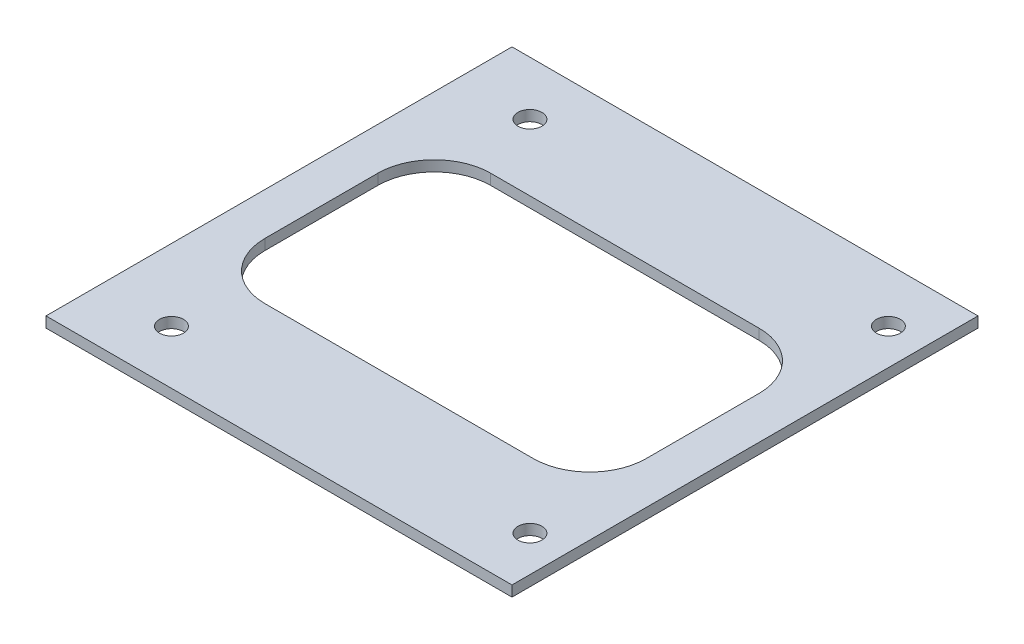
ISO-10303-21;
HEADER;
FILE_DESCRIPTION(('STEP AP214'),'2;1');
FILE_NAME('part.step','',(''),(''),'','','');
FILE_SCHEMA(('AUTOMOTIVE_DESIGN { 1 0 10303 214 1 1 1 1 }'));
ENDSEC;
DATA;
#1=APPLICATION_CONTEXT('core data for automotive mechanical design processes');
#2=APPLICATION_PROTOCOL_DEFINITION('international standard','automotive_design',2000,#1);
#3=PRODUCT_CONTEXT('',#1,'mechanical');
#4=PRODUCT('Part','Part','',(#3));
#5=PRODUCT_RELATED_PRODUCT_CATEGORY('part','',(#4));
#6=PRODUCT_DEFINITION_FORMATION('','',#4);
#7=PRODUCT_DEFINITION_CONTEXT('part definition',#1,'design');
#8=PRODUCT_DEFINITION('design','',#6,#7);
#9=PRODUCT_DEFINITION_SHAPE('','',#8);
#10=(LENGTH_UNIT() NAMED_UNIT(*) SI_UNIT(.MILLI.,.METRE.));
#11=(NAMED_UNIT(*) PLANE_ANGLE_UNIT() SI_UNIT($,.RADIAN.));
#12=(NAMED_UNIT(*) SI_UNIT($,.STERADIAN.) SOLID_ANGLE_UNIT());
#13=UNCERTAINTY_MEASURE_WITH_UNIT(LENGTH_MEASURE(1.E-05),#10,'distance_accuracy_value','');
#14=(GEOMETRIC_REPRESENTATION_CONTEXT(3) GLOBAL_UNCERTAINTY_ASSIGNED_CONTEXT((#13)) GLOBAL_UNIT_ASSIGNED_CONTEXT((#10,
#11,#12)) REPRESENTATION_CONTEXT('',''));
#15=CARTESIAN_POINT('',(0.,0.,0.));
#16=DIRECTION('',(0.,0.,1.));
#17=DIRECTION('',(1.,0.,0.));
#18=AXIS2_PLACEMENT_3D('',#15,#16,#17);
#19=CARTESIAN_POINT('',(82.55,3.75,-82.55));
#20=DIRECTION('',(-1.,0.,0.));
#21=DIRECTION('',(0.,0.,1.));
#22=AXIS2_PLACEMENT_3D('',#19,#20,#21);
#23=PLANE('',#22);
#24=DIRECTION('',(0.,0.,-1.));
#25=VECTOR('',#24,1.);
#26=CARTESIAN_POINT('',(82.55,0.,-82.55));
#27=LINE('',#26,#25);
#28=CARTESIAN_POINT('',(82.55,0.,82.55));
#29=VERTEX_POINT('',#28);
#30=CARTESIAN_POINT('',(82.55,0.,-82.55));
#31=VERTEX_POINT('',#30);
#32=EDGE_CURVE('E259',#29,#31,#27,.T.);
#33=ORIENTED_EDGE('',*,*,#32,.T.);
#34=DIRECTION('',(0.,-1.,0.));
#35=VECTOR('',#34,1.);
#36=CARTESIAN_POINT('',(82.55,3.75,-82.55));
#37=LINE('',#36,#35);
#38=CARTESIAN_POINT('',(82.55,3.75,-82.55));
#39=VERTEX_POINT('',#38);
#40=EDGE_CURVE('E13',#39,#31,#37,.T.);
#41=ORIENTED_EDGE('',*,*,#40,.F.);
#42=DIRECTION('',(0.,0.,-1.));
#43=VECTOR('',#42,1.);
#44=CARTESIAN_POINT('',(82.55,3.75,-82.55));
#45=LINE('',#44,#43);
#46=CARTESIAN_POINT('',(82.55,3.75,82.55));
#47=VERTEX_POINT('',#46);
#48=EDGE_CURVE('E260',#47,#39,#45,.T.);
#49=ORIENTED_EDGE('',*,*,#48,.F.);
#50=DIRECTION('',(0.,-1.,0.));
#51=VECTOR('',#50,1.);
#52=CARTESIAN_POINT('',(82.55,3.75,82.55));
#53=LINE('',#52,#51);
#54=EDGE_CURVE('E274',#47,#29,#53,.T.);
#55=ORIENTED_EDGE('',*,*,#54,.T.);
#56=EDGE_LOOP('',(#33,#41,#49,#55));
#57=FACE_BOUND('',#56,.T.);
#58=ADVANCED_FACE('F56',(#57),#23,.F.);
#59=CARTESIAN_POINT('',(-82.55,3.75,-82.55));
#60=DIRECTION('',(0.,0.,1.));
#61=DIRECTION('',(1.,0.,0.));
#62=AXIS2_PLACEMENT_3D('',#59,#60,#61);
#63=PLANE('',#62);
#64=DIRECTION('',(-1.,0.,0.));
#65=VECTOR('',#64,1.);
#66=CARTESIAN_POINT('',(-82.55,0.,-82.55));
#67=LINE('',#66,#65);
#68=CARTESIAN_POINT('',(-82.55,0.,-82.55));
#69=VERTEX_POINT('',#68);
#70=EDGE_CURVE('E278',#31,#69,#67,.T.);
#71=ORIENTED_EDGE('',*,*,#70,.T.);
#72=DIRECTION('',(0.,-1.,0.));
#73=VECTOR('',#72,1.);
#74=CARTESIAN_POINT('',(-82.55,3.75,-82.55));
#75=LINE('',#74,#73);
#76=CARTESIAN_POINT('',(-82.55,3.75,-82.55));
#77=VERTEX_POINT('',#76);
#78=EDGE_CURVE('E64',#77,#69,#75,.T.);
#79=ORIENTED_EDGE('',*,*,#78,.F.);
#80=DIRECTION('',(-1.,0.,0.));
#81=VECTOR('',#80,1.);
#82=CARTESIAN_POINT('',(-82.55,3.75,-82.55));
#83=LINE('',#82,#81);
#84=EDGE_CURVE('E264',#39,#77,#83,.T.);
#85=ORIENTED_EDGE('',*,*,#84,.F.);
#86=ORIENTED_EDGE('',*,*,#40,.T.);
#87=EDGE_LOOP('',(#71,#79,#85,#86));
#88=FACE_BOUND('',#87,.T.);
#89=ADVANCED_FACE('F312',(#88),#63,.F.);
#90=CARTESIAN_POINT('',(-82.55,3.75,-82.55));
#91=DIRECTION('',(1.,0.,0.));
#92=DIRECTION('',(0.,0.,-1.));
#93=AXIS2_PLACEMENT_3D('',#90,#91,#92);
#94=PLANE('',#93);
#95=DIRECTION('',(0.,0.,1.));
#96=VECTOR('',#95,1.);
#97=CARTESIAN_POINT('',(-82.55,0.,-82.55));
#98=LINE('',#97,#96);
#99=CARTESIAN_POINT('',(-82.55,0.,82.55));
#100=VERTEX_POINT('',#99);
#101=EDGE_CURVE('E281',#69,#100,#98,.T.);
#102=ORIENTED_EDGE('',*,*,#101,.T.);
#103=DIRECTION('',(0.,-1.,0.));
#104=VECTOR('',#103,1.);
#105=CARTESIAN_POINT('',(-82.55,3.75,82.55));
#106=LINE('',#105,#104);
#107=CARTESIAN_POINT('',(-82.55,3.75,82.55));
#108=VERTEX_POINT('',#107);
#109=EDGE_CURVE('E289',#108,#100,#106,.T.);
#110=ORIENTED_EDGE('',*,*,#109,.F.);
#111=DIRECTION('',(0.,0.,1.));
#112=VECTOR('',#111,1.);
#113=CARTESIAN_POINT('',(-82.55,3.75,-82.55));
#114=LINE('',#113,#112);
#115=EDGE_CURVE('E268',#77,#108,#114,.T.);
#116=ORIENTED_EDGE('',*,*,#115,.F.);
#117=ORIENTED_EDGE('',*,*,#78,.T.);
#118=EDGE_LOOP('',(#102,#110,#116,#117));
#119=FACE_BOUND('',#118,.T.);
#120=ADVANCED_FACE('F297',(#119),#94,.F.);
#121=CARTESIAN_POINT('',(-82.55,3.75,82.55));
#122=DIRECTION('',(0.,0.,-1.));
#123=DIRECTION('',(-1.,0.,0.));
#124=AXIS2_PLACEMENT_3D('',#121,#122,#123);
#125=PLANE('',#124);
#126=DIRECTION('',(1.,0.,0.));
#127=VECTOR('',#126,1.);
#128=CARTESIAN_POINT('',(-82.55,0.,82.55));
#129=LINE('',#128,#127);
#130=EDGE_CURVE('E265',#100,#29,#129,.T.);
#131=ORIENTED_EDGE('',*,*,#130,.T.);
#132=ORIENTED_EDGE('',*,*,#54,.F.);
#133=DIRECTION('',(1.,0.,0.));
#134=VECTOR('',#133,1.);
#135=CARTESIAN_POINT('',(-82.55,3.75,82.55));
#136=LINE('',#135,#134);
#137=EDGE_CURVE('E271',#108,#47,#136,.T.);
#138=ORIENTED_EDGE('',*,*,#137,.F.);
#139=ORIENTED_EDGE('',*,*,#109,.T.);
#140=EDGE_LOOP('',(#131,#132,#138,#139));
#141=FACE_BOUND('',#140,.T.);
#142=ADVANCED_FACE('F306',(#141),#125,.F.);
#143=CARTESIAN_POINT('',(0.,3.75,0.));
#144=DIRECTION('',(0.,1.,0.));
#145=DIRECTION('',(0.,0.,1.));
#146=AXIS2_PLACEMENT_3D('',#143,#144,#145);
#147=PLANE('',#146);
#148=CARTESIAN_POINT('',(-47.55,3.75,-19.9999999999999));
#149=DIRECTION('',(0.,1.,0.));
#150=DIRECTION('',(0.,0.,1.));
#151=AXIS2_PLACEMENT_3D('',#148,#149,#150);
#152=CIRCLE('',#151,20.);
#153=CARTESIAN_POINT('',(-67.55,3.75,-19.9999999999999));
#154=VERTEX_POINT('',#153);
#155=CARTESIAN_POINT('',(-47.55,3.75,-40.));
#156=VERTEX_POINT('',#155);
#157=EDGE_CURVE('E171',#154,#156,#152,.F.);
#158=ORIENTED_EDGE('',*,*,#157,.T.);
#159=DIRECTION('',(1.,0.,0.));
#160=VECTOR('',#159,1.);
#161=CARTESIAN_POINT('',(47.55,3.75,-39.9999999999999));
#162=LINE('',#161,#160);
#163=CARTESIAN_POINT('',(47.55,3.75,-39.9999999999999));
#164=VERTEX_POINT('',#163);
#165=EDGE_CURVE('E159',#156,#164,#162,.T.);
#166=ORIENTED_EDGE('',*,*,#165,.T.);
#167=CARTESIAN_POINT('',(47.55,3.75,-19.9999999999999));
#168=DIRECTION('',(0.,1.,0.));
#169=DIRECTION('',(0.,0.,1.));
#170=AXIS2_PLACEMENT_3D('',#167,#168,#169);
#171=CIRCLE('',#170,20.);
#172=CARTESIAN_POINT('',(67.55,3.75,-19.9999999999999));
#173=VERTEX_POINT('',#172);
#174=EDGE_CURVE('E382',#164,#173,#171,.F.);
#175=ORIENTED_EDGE('',*,*,#174,.T.);
#176=DIRECTION('',(0.,0.,1.));
#177=VECTOR('',#176,1.);
#178=CARTESIAN_POINT('',(67.55,3.75,20.0000000000001));
#179=LINE('',#178,#177);
#180=CARTESIAN_POINT('',(67.55,3.75,20.0000000000001));
#181=VERTEX_POINT('',#180);
#182=EDGE_CURVE('E385',#173,#181,#179,.T.);
#183=ORIENTED_EDGE('',*,*,#182,.T.);
#184=CARTESIAN_POINT('',(47.55,3.75,20.0000000000001));
#185=DIRECTION('',(0.,1.,0.));
#186=DIRECTION('',(0.,0.,1.));
#187=AXIS2_PLACEMENT_3D('',#184,#185,#186);
#188=CIRCLE('',#187,20.);
#189=CARTESIAN_POINT('',(47.55,3.75,40.0000000000001));
#190=VERTEX_POINT('',#189);
#191=EDGE_CURVE('E388',#181,#190,#188,.F.);
#192=ORIENTED_EDGE('',*,*,#191,.T.);
#193=DIRECTION('',(-1.,0.,0.));
#194=VECTOR('',#193,1.);
#195=CARTESIAN_POINT('',(-47.55,3.75,40.));
#196=LINE('',#195,#194);
#197=CARTESIAN_POINT('',(-47.55,3.75,40.));
#198=VERTEX_POINT('',#197);
#199=EDGE_CURVE('E394',#190,#198,#196,.T.);
#200=ORIENTED_EDGE('',*,*,#199,.T.);
#201=CARTESIAN_POINT('',(-47.55,3.75,20.0000000000001));
#202=DIRECTION('',(0.,1.,0.));
#203=DIRECTION('',(0.,0.,1.));
#204=AXIS2_PLACEMENT_3D('',#201,#202,#203);
#205=CIRCLE('',#204,20.);
#206=CARTESIAN_POINT('',(-67.55,3.75,20.0000000000001));
#207=VERTEX_POINT('',#206);
#208=EDGE_CURVE('E184',#198,#207,#205,.F.);
#209=ORIENTED_EDGE('',*,*,#208,.T.);
#210=DIRECTION('',(0.,0.,-1.));
#211=VECTOR('',#210,1.);
#212=CARTESIAN_POINT('',(-67.55,3.75,-19.9999999999999));
#213=LINE('',#212,#211);
#214=EDGE_CURVE('E179',#207,#154,#213,.T.);
#215=ORIENTED_EDGE('',*,*,#214,.T.);
#216=EDGE_LOOP('',(#158,#166,#175,#183,#192,#200,#209,#215));
#217=FACE_BOUND('',#216,.T.);
#218=CARTESIAN_POINT('',(69.8500000000001,3.75,63.5));
#219=DIRECTION('',(0.,1.,0.));
#220=DIRECTION('',(0.,0.,1.));
#221=AXIS2_PLACEMENT_3D('',#218,#219,#220);
#222=CIRCLE('',#221,4.25000000000001);
#223=CARTESIAN_POINT('',(69.8500000000001,3.75,67.75));
#224=VERTEX_POINT('',#223);
#225=EDGE_CURVE('E167',#224,#224,#222,.T.);
#226=ORIENTED_EDGE('',*,*,#225,.F.);
#227=EDGE_LOOP('',(#226));
#228=FACE_BOUND('',#227,.T.);
#229=CARTESIAN_POINT('',(-57.1499999999999,3.75,63.5));
#230=DIRECTION('',(0.,1.,0.));
#231=DIRECTION('',(0.,0.,1.));
#232=AXIS2_PLACEMENT_3D('',#229,#230,#231);
#233=CIRCLE('',#232,4.25);
#234=CARTESIAN_POINT('',(-57.1499999999999,3.75,67.75));
#235=VERTEX_POINT('',#234);
#236=EDGE_CURVE('E238',#235,#235,#233,.T.);
#237=ORIENTED_EDGE('',*,*,#236,.F.);
#238=EDGE_LOOP('',(#237));
#239=FACE_BOUND('',#238,.T.);
#240=CARTESIAN_POINT('',(-57.1499999999999,3.75,-63.4999999999999));
#241=DIRECTION('',(0.,1.,0.));
#242=DIRECTION('',(0.,0.,1.));
#243=AXIS2_PLACEMENT_3D('',#240,#241,#242);
#244=CIRCLE('',#243,4.25);
#245=CARTESIAN_POINT('',(-57.1499999999999,3.75,-59.2499999999999));
#246=VERTEX_POINT('',#245);
#247=EDGE_CURVE('E230',#246,#246,#244,.T.);
#248=ORIENTED_EDGE('',*,*,#247,.F.);
#249=EDGE_LOOP('',(#248));
#250=FACE_BOUND('',#249,.T.);
#251=CARTESIAN_POINT('',(69.8500000000001,3.75,-63.4999999999999));
#252=DIRECTION('',(0.,1.,0.));
#253=DIRECTION('',(0.,0.,1.));
#254=AXIS2_PLACEMENT_3D('',#251,#252,#253);
#255=CIRCLE('',#254,4.25000000000001);
#256=CARTESIAN_POINT('',(69.8500000000001,3.75,-59.2499999999999));
#257=VERTEX_POINT('',#256);
#258=EDGE_CURVE('E237',#257,#257,#255,.T.);
#259=ORIENTED_EDGE('',*,*,#258,.F.);
#260=EDGE_LOOP('',(#259));
#261=FACE_BOUND('',#260,.T.);
#262=ORIENTED_EDGE('',*,*,#48,.T.);
#263=ORIENTED_EDGE('',*,*,#84,.T.);
#264=ORIENTED_EDGE('',*,*,#115,.T.);
#265=ORIENTED_EDGE('',*,*,#137,.T.);
#266=EDGE_LOOP('',(#262,#263,#264,#265));
#267=FACE_BOUND('',#266,.T.);
#268=ADVANCED_FACE('F176',(#217,#228,#239,#250,#261,#267),#147,.T.);
#269=CARTESIAN_POINT('',(0.,0.,0.));
#270=DIRECTION('',(0.,1.,0.));
#271=DIRECTION('',(0.,0.,1.));
#272=AXIS2_PLACEMENT_3D('',#269,#270,#271);
#273=PLANE('',#272);
#274=DIRECTION('',(1.,0.,0.));
#275=VECTOR('',#274,1.);
#276=CARTESIAN_POINT('',(47.55,0.,-39.9999999999999));
#277=LINE('',#276,#275);
#278=CARTESIAN_POINT('',(-47.55,0.,-40.));
#279=VERTEX_POINT('',#278);
#280=CARTESIAN_POINT('',(47.55,0.,-39.9999999999999));
#281=VERTEX_POINT('',#280);
#282=EDGE_CURVE('E181',#279,#281,#277,.T.);
#283=ORIENTED_EDGE('',*,*,#282,.F.);
#284=CARTESIAN_POINT('',(-47.55,0.,-19.9999999999999));
#285=DIRECTION('',(0.,-1.,0.));
#286=DIRECTION('',(0.,0.,-1.));
#287=AXIS2_PLACEMENT_3D('',#284,#285,#286);
#288=CIRCLE('',#287,20.);
#289=CARTESIAN_POINT('',(-67.55,0.,-19.9999999999999));
#290=VERTEX_POINT('',#289);
#291=EDGE_CURVE('E82',#290,#279,#288,.T.);
#292=ORIENTED_EDGE('',*,*,#291,.F.);
#293=DIRECTION('',(0.,0.,-1.));
#294=VECTOR('',#293,1.);
#295=CARTESIAN_POINT('',(-67.55,0.,-19.9999999999999));
#296=LINE('',#295,#294);
#297=CARTESIAN_POINT('',(-67.55,0.,20.0000000000001));
#298=VERTEX_POINT('',#297);
#299=EDGE_CURVE('E173',#298,#290,#296,.T.);
#300=ORIENTED_EDGE('',*,*,#299,.F.);
#301=CARTESIAN_POINT('',(-47.55,0.,20.0000000000001));
#302=DIRECTION('',(0.,-1.,0.));
#303=DIRECTION('',(0.,0.,-1.));
#304=AXIS2_PLACEMENT_3D('',#301,#302,#303);
#305=CIRCLE('',#304,20.);
#306=CARTESIAN_POINT('',(-47.55,0.,40.));
#307=VERTEX_POINT('',#306);
#308=EDGE_CURVE('E206',#307,#298,#305,.T.);
#309=ORIENTED_EDGE('',*,*,#308,.F.);
#310=DIRECTION('',(-1.,0.,0.));
#311=VECTOR('',#310,1.);
#312=CARTESIAN_POINT('',(-47.55,0.,40.));
#313=LINE('',#312,#311);
#314=CARTESIAN_POINT('',(47.55,0.,40.0000000000001));
#315=VERTEX_POINT('',#314);
#316=EDGE_CURVE('E202',#315,#307,#313,.T.);
#317=ORIENTED_EDGE('',*,*,#316,.F.);
#318=CARTESIAN_POINT('',(47.55,0.,20.0000000000001));
#319=DIRECTION('',(0.,-1.,0.));
#320=DIRECTION('',(0.,0.,-1.));
#321=AXIS2_PLACEMENT_3D('',#318,#319,#320);
#322=CIRCLE('',#321,20.);
#323=CARTESIAN_POINT('',(67.55,0.,20.0000000000001));
#324=VERTEX_POINT('',#323);
#325=EDGE_CURVE('E198',#324,#315,#322,.T.);
#326=ORIENTED_EDGE('',*,*,#325,.F.);
#327=DIRECTION('',(0.,0.,1.));
#328=VECTOR('',#327,1.);
#329=CARTESIAN_POINT('',(67.55,0.,20.0000000000001));
#330=LINE('',#329,#328);
#331=CARTESIAN_POINT('',(67.55,0.,-19.9999999999999));
#332=VERTEX_POINT('',#331);
#333=EDGE_CURVE('E194',#332,#324,#330,.T.);
#334=ORIENTED_EDGE('',*,*,#333,.F.);
#335=CARTESIAN_POINT('',(47.55,0.,-19.9999999999999));
#336=DIRECTION('',(0.,-1.,0.));
#337=DIRECTION('',(0.,0.,-1.));
#338=AXIS2_PLACEMENT_3D('',#335,#336,#337);
#339=CIRCLE('',#338,20.);
#340=EDGE_CURVE('E190',#281,#332,#339,.T.);
#341=ORIENTED_EDGE('',*,*,#340,.F.);
#342=EDGE_LOOP('',(#283,#292,#300,#309,#317,#326,#334,#341));
#343=FACE_BOUND('',#342,.T.);
#344=CARTESIAN_POINT('',(69.8500000000001,0.,63.5));
#345=DIRECTION('',(0.,1.,0.));
#346=DIRECTION('',(0.,0.,1.));
#347=AXIS2_PLACEMENT_3D('',#344,#345,#346);
#348=CIRCLE('',#347,4.25000000000001);
#349=CARTESIAN_POINT('',(69.8500000000001,0.,67.75));
#350=VERTEX_POINT('',#349);
#351=EDGE_CURVE('E242',#350,#350,#348,.F.);
#352=ORIENTED_EDGE('',*,*,#351,.F.);
#353=EDGE_LOOP('',(#352));
#354=FACE_BOUND('',#353,.T.);
#355=CARTESIAN_POINT('',(-57.1499999999999,0.,63.5));
#356=DIRECTION('',(0.,1.,0.));
#357=DIRECTION('',(0.,0.,1.));
#358=AXIS2_PLACEMENT_3D('',#355,#356,#357);
#359=CIRCLE('',#358,4.25);
#360=CARTESIAN_POINT('',(-57.1499999999999,0.,67.75));
#361=VERTEX_POINT('',#360);
#362=EDGE_CURVE('E234',#361,#361,#359,.F.);
#363=ORIENTED_EDGE('',*,*,#362,.F.);
#364=EDGE_LOOP('',(#363));
#365=FACE_BOUND('',#364,.T.);
#366=CARTESIAN_POINT('',(-57.1499999999999,0.,-63.4999999999999));
#367=DIRECTION('',(0.,1.,0.));
#368=DIRECTION('',(0.,0.,1.));
#369=AXIS2_PLACEMENT_3D('',#366,#367,#368);
#370=CIRCLE('',#369,4.25);
#371=CARTESIAN_POINT('',(-57.1499999999999,0.,-59.2499999999999));
#372=VERTEX_POINT('',#371);
#373=EDGE_CURVE('E233',#372,#372,#370,.F.);
#374=ORIENTED_EDGE('',*,*,#373,.F.);
#375=EDGE_LOOP('',(#374));
#376=FACE_BOUND('',#375,.T.);
#377=CARTESIAN_POINT('',(69.8500000000001,0.,-63.4999999999999));
#378=DIRECTION('',(0.,1.,0.));
#379=DIRECTION('',(0.,0.,1.));
#380=AXIS2_PLACEMENT_3D('',#377,#378,#379);
#381=CIRCLE('',#380,4.25000000000001);
#382=CARTESIAN_POINT('',(69.8500000000001,0.,-59.2499999999999));
#383=VERTEX_POINT('',#382);
#384=EDGE_CURVE('E255',#383,#383,#381,.F.);
#385=ORIENTED_EDGE('',*,*,#384,.F.);
#386=EDGE_LOOP('',(#385));
#387=FACE_BOUND('',#386,.T.);
#388=ORIENTED_EDGE('',*,*,#32,.F.);
#389=ORIENTED_EDGE('',*,*,#130,.F.);
#390=ORIENTED_EDGE('',*,*,#101,.F.);
#391=ORIENTED_EDGE('',*,*,#70,.F.);
#392=EDGE_LOOP('',(#388,#389,#390,#391));
#393=FACE_BOUND('',#392,.T.);
#394=ADVANCED_FACE('F303',(#343,#354,#365,#376,#387,#393),#273,.F.);
#395=CARTESIAN_POINT('',(69.8500000000001,-0.001000000000001,-63.4999999999999));
#396=DIRECTION('',(0.,1.,0.));
#397=DIRECTION('',(0.,0.,1.));
#398=AXIS2_PLACEMENT_3D('',#395,#396,#397);
#399=CYLINDRICAL_SURFACE('',#398,4.25000000000001);
#400=ORIENTED_EDGE('',*,*,#258,.T.);
#401=EDGE_LOOP('',(#400));
#402=FACE_BOUND('',#401,.T.);
#403=ORIENTED_EDGE('',*,*,#384,.T.);
#404=EDGE_LOOP('',(#403));
#405=FACE_BOUND('',#404,.T.);
#406=ADVANCED_FACE('F324',(#402,#405),#399,.F.);
#407=CARTESIAN_POINT('',(-57.1499999999999,-0.001000000000001,-63.4999999999999));
#408=DIRECTION('',(0.,1.,0.));
#409=DIRECTION('',(0.,0.,1.));
#410=AXIS2_PLACEMENT_3D('',#407,#408,#409);
#411=CYLINDRICAL_SURFACE('',#410,4.25);
#412=ORIENTED_EDGE('',*,*,#247,.T.);
#413=EDGE_LOOP('',(#412));
#414=FACE_BOUND('',#413,.T.);
#415=ORIENTED_EDGE('',*,*,#373,.T.);
#416=EDGE_LOOP('',(#415));
#417=FACE_BOUND('',#416,.T.);
#418=ADVANCED_FACE('F330',(#414,#417),#411,.F.);
#419=CARTESIAN_POINT('',(-57.1499999999999,-0.001000000000001,63.5));
#420=DIRECTION('',(0.,1.,0.));
#421=DIRECTION('',(0.,0.,1.));
#422=AXIS2_PLACEMENT_3D('',#419,#420,#421);
#423=CYLINDRICAL_SURFACE('',#422,4.25);
#424=ORIENTED_EDGE('',*,*,#236,.T.);
#425=EDGE_LOOP('',(#424));
#426=FACE_BOUND('',#425,.T.);
#427=ORIENTED_EDGE('',*,*,#362,.T.);
#428=EDGE_LOOP('',(#427));
#429=FACE_BOUND('',#428,.T.);
#430=ADVANCED_FACE('F335',(#426,#429),#423,.F.);
#431=CARTESIAN_POINT('',(69.8500000000001,-0.001000000000001,63.5));
#432=DIRECTION('',(0.,1.,0.));
#433=DIRECTION('',(0.,0.,1.));
#434=AXIS2_PLACEMENT_3D('',#431,#432,#433);
#435=CYLINDRICAL_SURFACE('',#434,4.25000000000001);
#436=ORIENTED_EDGE('',*,*,#225,.T.);
#437=EDGE_LOOP('',(#436));
#438=FACE_BOUND('',#437,.T.);
#439=ORIENTED_EDGE('',*,*,#351,.T.);
#440=EDGE_LOOP('',(#439));
#441=FACE_BOUND('',#440,.T.);
#442=ADVANCED_FACE('F332',(#438,#441),#435,.F.);
#443=CARTESIAN_POINT('',(-47.55,3.751,-19.9999999999999));
#444=DIRECTION('',(0.,-1.,0.));
#445=DIRECTION('',(0.,0.,-1.));
#446=AXIS2_PLACEMENT_3D('',#443,#444,#445);
#447=CYLINDRICAL_SURFACE('',#446,20.);
#448=DIRECTION('',(0.,-1.,0.));
#449=VECTOR('',#448,1.);
#450=CARTESIAN_POINT('',(-67.55,3.751,-19.9999999999999));
#451=LINE('',#450,#449);
#452=EDGE_CURVE('E168',#154,#290,#451,.T.);
#453=ORIENTED_EDGE('',*,*,#452,.T.);
#454=ORIENTED_EDGE('',*,*,#291,.T.);
#455=DIRECTION('',(0.,-1.,0.));
#456=VECTOR('',#455,1.);
#457=CARTESIAN_POINT('',(-47.55,3.751,-40.));
#458=LINE('',#457,#456);
#459=EDGE_CURVE('E161',#156,#279,#458,.T.);
#460=ORIENTED_EDGE('',*,*,#459,.F.);
#461=ORIENTED_EDGE('',*,*,#157,.F.);
#462=EDGE_LOOP('',(#453,#454,#460,#461));
#463=FACE_BOUND('',#462,.T.);
#464=ADVANCED_FACE('F170',(#463),#447,.F.);
#465=CARTESIAN_POINT('',(-67.55,3.751,-19.9999999999999));
#466=DIRECTION('',(-1.,0.,0.));
#467=DIRECTION('',(0.,0.,1.));
#468=AXIS2_PLACEMENT_3D('',#465,#466,#467);
#469=PLANE('',#468);
#470=DIRECTION('',(0.,-1.,0.));
#471=VECTOR('',#470,1.);
#472=CARTESIAN_POINT('',(-67.55,3.751,20.0000000000001));
#473=LINE('',#472,#471);
#474=EDGE_CURVE('E214',#207,#298,#473,.T.);
#475=ORIENTED_EDGE('',*,*,#474,.T.);
#476=ORIENTED_EDGE('',*,*,#299,.T.);
#477=ORIENTED_EDGE('',*,*,#452,.F.);
#478=ORIENTED_EDGE('',*,*,#214,.F.);
#479=EDGE_LOOP('',(#475,#476,#477,#478));
#480=FACE_BOUND('',#479,.T.);
#481=ADVANCED_FACE('F345',(#480),#469,.F.);
#482=CARTESIAN_POINT('',(-47.55,3.751,20.0000000000001));
#483=DIRECTION('',(0.,-1.,0.));
#484=DIRECTION('',(0.,0.,-1.));
#485=AXIS2_PLACEMENT_3D('',#482,#483,#484);
#486=CYLINDRICAL_SURFACE('',#485,20.);
#487=DIRECTION('',(0.,-1.,0.));
#488=VECTOR('',#487,1.);
#489=CARTESIAN_POINT('',(-47.55,3.751,40.));
#490=LINE('',#489,#488);
#491=EDGE_CURVE('E217',#198,#307,#490,.T.);
#492=ORIENTED_EDGE('',*,*,#491,.T.);
#493=ORIENTED_EDGE('',*,*,#308,.T.);
#494=ORIENTED_EDGE('',*,*,#474,.F.);
#495=ORIENTED_EDGE('',*,*,#208,.F.);
#496=EDGE_LOOP('',(#492,#493,#494,#495));
#497=FACE_BOUND('',#496,.T.);
#498=ADVANCED_FACE('F363',(#497),#486,.F.);
#499=CARTESIAN_POINT('',(-47.55,3.751,40.));
#500=DIRECTION('',(0.,0.,1.));
#501=DIRECTION('',(1.,0.,0.));
#502=AXIS2_PLACEMENT_3D('',#499,#500,#501);
#503=PLANE('',#502);
#504=DIRECTION('',(0.,-1.,0.));
#505=VECTOR('',#504,1.);
#506=CARTESIAN_POINT('',(47.55,3.751,40.0000000000001));
#507=LINE('',#506,#505);
#508=EDGE_CURVE('E220',#190,#315,#507,.T.);
#509=ORIENTED_EDGE('',*,*,#508,.T.);
#510=ORIENTED_EDGE('',*,*,#316,.T.);
#511=ORIENTED_EDGE('',*,*,#491,.F.);
#512=ORIENTED_EDGE('',*,*,#199,.F.);
#513=EDGE_LOOP('',(#509,#510,#511,#512));
#514=FACE_BOUND('',#513,.T.);
#515=ADVANCED_FACE('F359',(#514),#503,.F.);
#516=CARTESIAN_POINT('',(47.55,3.751,20.0000000000001));
#517=DIRECTION('',(0.,-1.,0.));
#518=DIRECTION('',(0.,0.,-1.));
#519=AXIS2_PLACEMENT_3D('',#516,#517,#518);
#520=CYLINDRICAL_SURFACE('',#519,20.);
#521=DIRECTION('',(0.,-1.,0.));
#522=VECTOR('',#521,1.);
#523=CARTESIAN_POINT('',(67.55,3.751,20.0000000000001));
#524=LINE('',#523,#522);
#525=EDGE_CURVE('E223',#181,#324,#524,.T.);
#526=ORIENTED_EDGE('',*,*,#525,.T.);
#527=ORIENTED_EDGE('',*,*,#325,.T.);
#528=ORIENTED_EDGE('',*,*,#508,.F.);
#529=ORIENTED_EDGE('',*,*,#191,.F.);
#530=EDGE_LOOP('',(#526,#527,#528,#529));
#531=FACE_BOUND('',#530,.T.);
#532=ADVANCED_FACE('F355',(#531),#520,.F.);
#533=CARTESIAN_POINT('',(67.55,3.751,20.0000000000001));
#534=DIRECTION('',(1.,0.,0.));
#535=DIRECTION('',(0.,0.,-1.));
#536=AXIS2_PLACEMENT_3D('',#533,#534,#535);
#537=PLANE('',#536);
#538=DIRECTION('',(0.,-1.,0.));
#539=VECTOR('',#538,1.);
#540=CARTESIAN_POINT('',(67.55,3.751,-19.9999999999999));
#541=LINE('',#540,#539);
#542=EDGE_CURVE('E225',#173,#332,#541,.T.);
#543=ORIENTED_EDGE('',*,*,#542,.T.);
#544=ORIENTED_EDGE('',*,*,#333,.T.);
#545=ORIENTED_EDGE('',*,*,#525,.F.);
#546=ORIENTED_EDGE('',*,*,#182,.F.);
#547=EDGE_LOOP('',(#543,#544,#545,#546));
#548=FACE_BOUND('',#547,.T.);
#549=ADVANCED_FACE('F351',(#548),#537,.F.);
#550=CARTESIAN_POINT('',(47.55,3.751,-19.9999999999999));
#551=DIRECTION('',(0.,-1.,0.));
#552=DIRECTION('',(0.,0.,-1.));
#553=AXIS2_PLACEMENT_3D('',#550,#551,#552);
#554=CYLINDRICAL_SURFACE('',#553,20.);
#555=DIRECTION('',(0.,-1.,0.));
#556=VECTOR('',#555,1.);
#557=CARTESIAN_POINT('',(47.55,3.751,-39.9999999999999));
#558=LINE('',#557,#556);
#559=EDGE_CURVE('E74',#164,#281,#558,.T.);
#560=ORIENTED_EDGE('',*,*,#559,.T.);
#561=ORIENTED_EDGE('',*,*,#340,.T.);
#562=ORIENTED_EDGE('',*,*,#542,.F.);
#563=ORIENTED_EDGE('',*,*,#174,.F.);
#564=EDGE_LOOP('',(#560,#561,#562,#563));
#565=FACE_BOUND('',#564,.T.);
#566=ADVANCED_FACE('F348',(#565),#554,.F.);
#567=CARTESIAN_POINT('',(47.55,3.751,-39.9999999999999));
#568=DIRECTION('',(0.,0.,-1.));
#569=DIRECTION('',(-1.,0.,0.));
#570=AXIS2_PLACEMENT_3D('',#567,#568,#569);
#571=PLANE('',#570);
#572=ORIENTED_EDGE('',*,*,#459,.T.);
#573=ORIENTED_EDGE('',*,*,#282,.T.);
#574=ORIENTED_EDGE('',*,*,#559,.F.);
#575=ORIENTED_EDGE('',*,*,#165,.F.);
#576=EDGE_LOOP('',(#572,#573,#574,#575));
#577=FACE_BOUND('',#576,.T.);
#578=ADVANCED_FACE('F160',(#577),#571,.F.);
#579=CLOSED_SHELL('',(#58,#89,#120,#142,#268,#394,#406,#418,#430,#442,#464,#481,#498,#515,#532,
#549,#566,#578));
#580=MANIFOLD_SOLID_BREP('B2',#579);
#581=ADVANCED_BREP_SHAPE_REPRESENTATION('',(#18,#580),#14);
#582=SHAPE_DEFINITION_REPRESENTATION(#9,#581);
ENDSEC;
END-ISO-10303-21;
